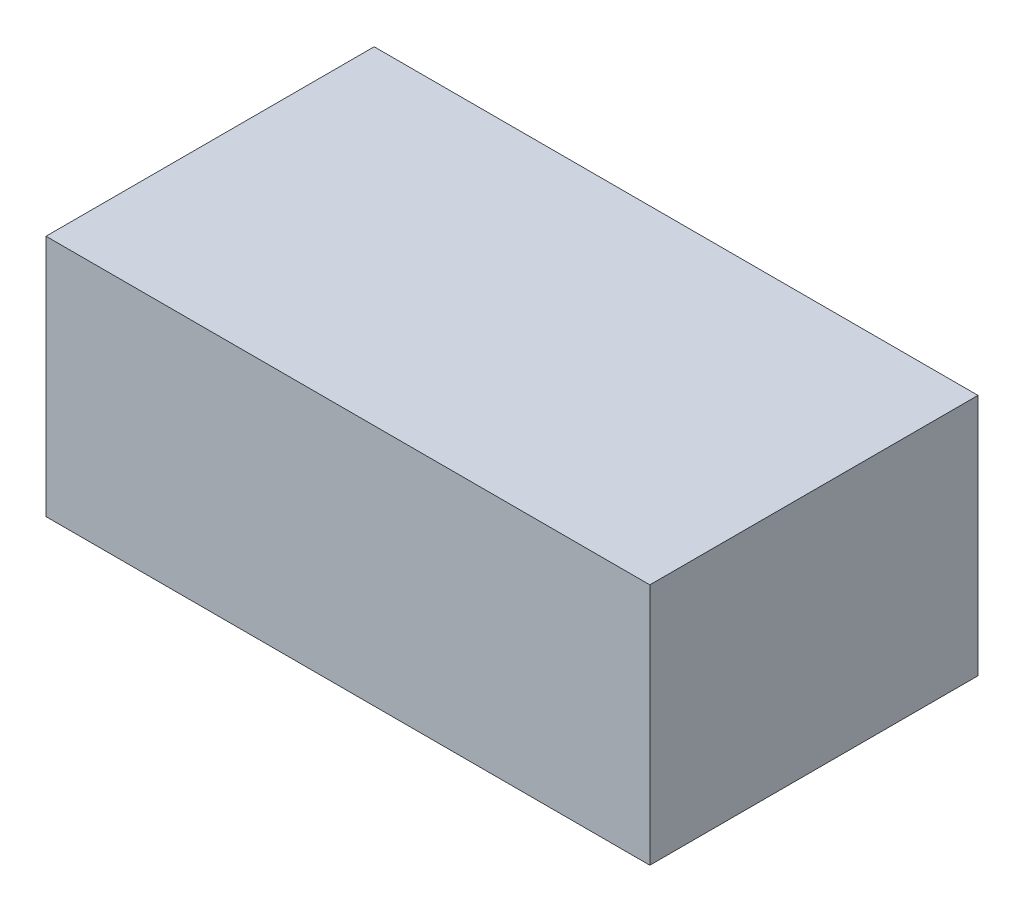
ISO-10303-21;
HEADER;
FILE_DESCRIPTION(('STEP AP214'),'2;1');
FILE_NAME('part.step','',(''),(''),'','','');
FILE_SCHEMA(('AUTOMOTIVE_DESIGN { 1 0 10303 214 1 1 1 1 }'));
ENDSEC;
DATA;
#1=APPLICATION_CONTEXT('core data for automotive mechanical design processes');
#2=APPLICATION_PROTOCOL_DEFINITION('international standard','automotive_design',2000,#1);
#3=PRODUCT_CONTEXT('',#1,'mechanical');
#4=PRODUCT('Part','Part','',(#3));
#5=PRODUCT_RELATED_PRODUCT_CATEGORY('part','',(#4));
#6=PRODUCT_DEFINITION_FORMATION('','',#4);
#7=PRODUCT_DEFINITION_CONTEXT('part definition',#1,'design');
#8=PRODUCT_DEFINITION('design','',#6,#7);
#9=PRODUCT_DEFINITION_SHAPE('','',#8);
#10=(LENGTH_UNIT() NAMED_UNIT(*) SI_UNIT(.MILLI.,.METRE.));
#11=(NAMED_UNIT(*) PLANE_ANGLE_UNIT() SI_UNIT($,.RADIAN.));
#12=(NAMED_UNIT(*) SI_UNIT($,.STERADIAN.) SOLID_ANGLE_UNIT());
#13=UNCERTAINTY_MEASURE_WITH_UNIT(LENGTH_MEASURE(1.E-05),#10,'distance_accuracy_value','');
#14=(GEOMETRIC_REPRESENTATION_CONTEXT(3) GLOBAL_UNCERTAINTY_ASSIGNED_CONTEXT((#13)) GLOBAL_UNIT_ASSIGNED_CONTEXT((#10,
#11,#12)) REPRESENTATION_CONTEXT('',''));
#15=CARTESIAN_POINT('',(0.,0.,0.));
#16=DIRECTION('',(0.,0.,1.));
#17=DIRECTION('',(1.,0.,0.));
#18=AXIS2_PLACEMENT_3D('',#15,#16,#17);
#19=CARTESIAN_POINT('',(4.778,3.3856,2.4852));
#20=DIRECTION('',(-1.,0.,0.));
#21=DIRECTION('',(0.,0.,1.));
#22=AXIS2_PLACEMENT_3D('',#19,#20,#21);
#23=PLANE('',#22);
#24=DIRECTION('',(0.,0.,-1.));
#25=VECTOR('',#24,1.);
#26=CARTESIAN_POINT('',(4.778,3.0156,2.4852));
#27=LINE('',#26,#25);
#28=CARTESIAN_POINT('',(4.778,3.0156,2.4852));
#29=VERTEX_POINT('',#28);
#30=CARTESIAN_POINT('',(4.778,3.0156,1.9852));
#31=VERTEX_POINT('',#30);
#32=EDGE_CURVE('E11',#29,#31,#27,.T.);
#33=ORIENTED_EDGE('',*,*,#32,.T.);
#34=DIRECTION('',(0.,-1.,0.));
#35=VECTOR('',#34,1.);
#36=CARTESIAN_POINT('',(4.778,3.3856,1.9852));
#37=LINE('',#36,#35);
#38=CARTESIAN_POINT('',(4.778,3.3856,1.9852));
#39=VERTEX_POINT('',#38);
#40=EDGE_CURVE('E24',#39,#31,#37,.T.);
#41=ORIENTED_EDGE('',*,*,#40,.F.);
#42=DIRECTION('',(0.,0.,-1.));
#43=VECTOR('',#42,1.);
#44=CARTESIAN_POINT('',(4.778,3.3856,2.4852));
#45=LINE('',#44,#43);
#46=CARTESIAN_POINT('',(4.778,3.3856,2.4852));
#47=VERTEX_POINT('',#46);
#48=EDGE_CURVE('E88',#47,#39,#45,.T.);
#49=ORIENTED_EDGE('',*,*,#48,.F.);
#50=DIRECTION('',(0.,-1.,0.));
#51=VECTOR('',#50,1.);
#52=CARTESIAN_POINT('',(4.778,3.3856,2.4852));
#53=LINE('',#52,#51);
#54=EDGE_CURVE('E77',#47,#29,#53,.T.);
#55=ORIENTED_EDGE('',*,*,#54,.T.);
#56=EDGE_LOOP('',(#33,#41,#49,#55));
#57=FACE_BOUND('',#56,.T.);
#58=ADVANCED_FACE('F17',(#57),#23,.F.);
#59=CARTESIAN_POINT('',(3.858,3.3856,1.9852));
#60=DIRECTION('',(0.,0.,1.));
#61=DIRECTION('',(1.,0.,0.));
#62=AXIS2_PLACEMENT_3D('',#59,#60,#61);
#63=PLANE('',#62);
#64=DIRECTION('',(-1.,0.,0.));
#65=VECTOR('',#64,1.);
#66=CARTESIAN_POINT('',(3.858,3.0156,1.9852));
#67=LINE('',#66,#65);
#68=CARTESIAN_POINT('',(3.858,3.0156,1.9852));
#69=VERTEX_POINT('',#68);
#70=EDGE_CURVE('E85',#31,#69,#67,.T.);
#71=ORIENTED_EDGE('',*,*,#70,.T.);
#72=DIRECTION('',(0.,-1.,0.));
#73=VECTOR('',#72,1.);
#74=CARTESIAN_POINT('',(3.858,3.3856,1.9852));
#75=LINE('',#74,#73);
#76=CARTESIAN_POINT('',(3.858,3.3856,1.9852));
#77=VERTEX_POINT('',#76);
#78=EDGE_CURVE('E83',#77,#69,#75,.T.);
#79=ORIENTED_EDGE('',*,*,#78,.F.);
#80=DIRECTION('',(-1.,0.,0.));
#81=VECTOR('',#80,1.);
#82=CARTESIAN_POINT('',(3.858,3.3856,1.9852));
#83=LINE('',#82,#81);
#84=EDGE_CURVE('E72',#39,#77,#83,.T.);
#85=ORIENTED_EDGE('',*,*,#84,.F.);
#86=ORIENTED_EDGE('',*,*,#40,.T.);
#87=EDGE_LOOP('',(#71,#79,#85,#86));
#88=FACE_BOUND('',#87,.T.);
#89=ADVANCED_FACE('F90',(#88),#63,.F.);
#90=CARTESIAN_POINT('',(3.858,3.3856,2.4852));
#91=DIRECTION('',(1.,0.,0.));
#92=DIRECTION('',(0.,0.,-1.));
#93=AXIS2_PLACEMENT_3D('',#90,#91,#92);
#94=PLANE('',#93);
#95=DIRECTION('',(0.,0.,1.));
#96=VECTOR('',#95,1.);
#97=CARTESIAN_POINT('',(3.858,3.0156,2.4852));
#98=LINE('',#97,#96);
#99=CARTESIAN_POINT('',(3.858,3.0156,2.4852));
#100=VERTEX_POINT('',#99);
#101=EDGE_CURVE('E60',#69,#100,#98,.T.);
#102=ORIENTED_EDGE('',*,*,#101,.T.);
#103=DIRECTION('',(0.,-1.,0.));
#104=VECTOR('',#103,1.);
#105=CARTESIAN_POINT('',(3.858,3.3856,2.4852));
#106=LINE('',#105,#104);
#107=CARTESIAN_POINT('',(3.858,3.3856,2.4852));
#108=VERTEX_POINT('',#107);
#109=EDGE_CURVE('E54',#108,#100,#106,.T.);
#110=ORIENTED_EDGE('',*,*,#109,.F.);
#111=DIRECTION('',(0.,0.,1.));
#112=VECTOR('',#111,1.);
#113=CARTESIAN_POINT('',(3.858,3.3856,2.4852));
#114=LINE('',#113,#112);
#115=EDGE_CURVE('E58',#77,#108,#114,.T.);
#116=ORIENTED_EDGE('',*,*,#115,.F.);
#117=ORIENTED_EDGE('',*,*,#78,.T.);
#118=EDGE_LOOP('',(#102,#110,#116,#117));
#119=FACE_BOUND('',#118,.T.);
#120=ADVANCED_FACE('F56',(#119),#94,.F.);
#121=CARTESIAN_POINT('',(3.858,3.3856,2.4852));
#122=DIRECTION('',(0.,0.,-1.));
#123=DIRECTION('',(-1.,0.,0.));
#124=AXIS2_PLACEMENT_3D('',#121,#122,#123);
#125=PLANE('',#124);
#126=DIRECTION('',(1.,0.,0.));
#127=VECTOR('',#126,1.);
#128=CARTESIAN_POINT('',(3.858,3.0156,2.4852));
#129=LINE('',#128,#127);
#130=EDGE_CURVE('E73',#100,#29,#129,.T.);
#131=ORIENTED_EDGE('',*,*,#130,.T.);
#132=ORIENTED_EDGE('',*,*,#54,.F.);
#133=DIRECTION('',(1.,0.,0.));
#134=VECTOR('',#133,1.);
#135=CARTESIAN_POINT('',(3.858,3.3856,2.4852));
#136=LINE('',#135,#134);
#137=EDGE_CURVE('E70',#108,#47,#136,.T.);
#138=ORIENTED_EDGE('',*,*,#137,.F.);
#139=ORIENTED_EDGE('',*,*,#109,.T.);
#140=EDGE_LOOP('',(#131,#132,#138,#139));
#141=FACE_BOUND('',#140,.T.);
#142=ADVANCED_FACE('F76',(#141),#125,.F.);
#143=CARTESIAN_POINT('',(4.318,3.3856,2.2352));
#144=DIRECTION('',(0.,-1.,0.));
#145=DIRECTION('',(0.,0.,-1.));
#146=AXIS2_PLACEMENT_3D('',#143,#144,#145);
#147=PLANE('',#146);
#148=ORIENTED_EDGE('',*,*,#48,.T.);
#149=ORIENTED_EDGE('',*,*,#84,.T.);
#150=ORIENTED_EDGE('',*,*,#115,.T.);
#151=ORIENTED_EDGE('',*,*,#137,.T.);
#152=EDGE_LOOP('',(#148,#149,#150,#151));
#153=FACE_BOUND('',#152,.T.);
#154=ADVANCED_FACE('F69',(#153),#147,.F.);
#155=CARTESIAN_POINT('',(4.318,3.0156,2.2352));
#156=DIRECTION('',(0.,-1.,0.));
#157=DIRECTION('',(0.,0.,-1.));
#158=AXIS2_PLACEMENT_3D('',#155,#156,#157);
#159=PLANE('',#158);
#160=ORIENTED_EDGE('',*,*,#32,.F.);
#161=ORIENTED_EDGE('',*,*,#130,.F.);
#162=ORIENTED_EDGE('',*,*,#101,.F.);
#163=ORIENTED_EDGE('',*,*,#70,.F.);
#164=EDGE_LOOP('',(#160,#161,#162,#163));
#165=FACE_BOUND('',#164,.T.);
#166=ADVANCED_FACE('F91',(#165),#159,.T.);
#167=CLOSED_SHELL('',(#58,#89,#120,#142,#154,#166));
#168=MANIFOLD_SOLID_BREP('B1',#167);
#169=ADVANCED_BREP_SHAPE_REPRESENTATION('',(#18,#168),#14);
#170=SHAPE_DEFINITION_REPRESENTATION(#9,#169);
ENDSEC;
END-ISO-10303-21;
